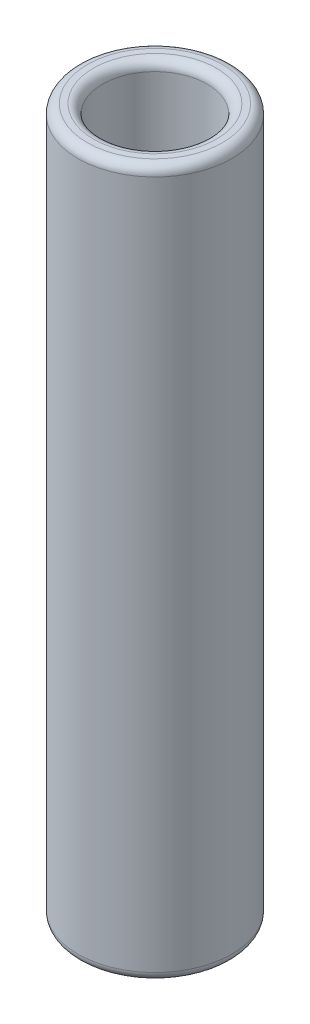
ISO-10303-21;
HEADER;
FILE_DESCRIPTION(('STEP AP214'),'2;1');
FILE_NAME('part.step','',(''),(''),'','','');
FILE_SCHEMA(('AUTOMOTIVE_DESIGN { 1 0 10303 214 1 1 1 1 }'));
ENDSEC;
DATA;
#1=APPLICATION_CONTEXT('core data for automotive mechanical design processes');
#2=APPLICATION_PROTOCOL_DEFINITION('international standard','automotive_design',2000,#1);
#3=PRODUCT_CONTEXT('',#1,'mechanical');
#4=PRODUCT('Part','Part','',(#3));
#5=PRODUCT_RELATED_PRODUCT_CATEGORY('part','',(#4));
#6=PRODUCT_DEFINITION_FORMATION('','',#4);
#7=PRODUCT_DEFINITION_CONTEXT('part definition',#1,'design');
#8=PRODUCT_DEFINITION('design','',#6,#7);
#9=PRODUCT_DEFINITION_SHAPE('','',#8);
#10=(LENGTH_UNIT() NAMED_UNIT(*) SI_UNIT(.MILLI.,.METRE.));
#11=(NAMED_UNIT(*) PLANE_ANGLE_UNIT() SI_UNIT($,.RADIAN.));
#12=(NAMED_UNIT(*) SI_UNIT($,.STERADIAN.) SOLID_ANGLE_UNIT());
#13=UNCERTAINTY_MEASURE_WITH_UNIT(LENGTH_MEASURE(1.E-05),#10,'distance_accuracy_value','');
#14=(GEOMETRIC_REPRESENTATION_CONTEXT(3) GLOBAL_UNCERTAINTY_ASSIGNED_CONTEXT((#13)) GLOBAL_UNIT_ASSIGNED_CONTEXT((#10,
#11,#12)) REPRESENTATION_CONTEXT('',''));
#15=CARTESIAN_POINT('',(0.,0.,0.));
#16=DIRECTION('',(0.,0.,1.));
#17=DIRECTION('',(1.,0.,0.));
#18=AXIS2_PLACEMENT_3D('',#15,#16,#17);
#19=CARTESIAN_POINT('',(0.,23.,0.));
#20=DIRECTION('',(0.,1.,0.));
#21=DIRECTION('',(0.,0.,1.));
#22=AXIS2_PLACEMENT_3D('',#19,#20,#21);
#23=PLANE('',#22);
#24=CARTESIAN_POINT('',(0.,23.,0.));
#25=DIRECTION('',(0.,1.,0.));
#26=DIRECTION('',(0.,0.,1.));
#27=AXIS2_PLACEMENT_3D('',#24,#25,#26);
#28=CIRCLE('',#27,2.);
#29=CARTESIAN_POINT('',(0.,23.,2.));
#30=VERTEX_POINT('',#29);
#31=EDGE_CURVE('E10',#30,#30,#28,.F.);
#32=ORIENTED_EDGE('',*,*,#31,.T.);
#33=EDGE_LOOP('',(#32));
#34=FACE_BOUND('',#33,.T.);
#35=CARTESIAN_POINT('',(0.,23.,0.));
#36=DIRECTION('',(0.,1.,0.));
#37=DIRECTION('',(0.,0.,1.));
#38=AXIS2_PLACEMENT_3D('',#35,#36,#37);
#39=CIRCLE('',#38,2.2);
#40=CARTESIAN_POINT('',(0.,23.,2.2));
#41=VERTEX_POINT('',#40);
#42=EDGE_CURVE('E42',#41,#41,#39,.T.);
#43=ORIENTED_EDGE('',*,*,#42,.T.);
#44=EDGE_LOOP('',(#43));
#45=FACE_BOUND('',#44,.T.);
#46=ADVANCED_FACE('F35',(#34,#45),#23,.T.);
#47=CARTESIAN_POINT('',(0.,0.,0.));
#48=DIRECTION('',(0.,1.,0.));
#49=DIRECTION('',(0.,0.,1.));
#50=AXIS2_PLACEMENT_3D('',#47,#48,#49);
#51=PLANE('',#50);
#52=CARTESIAN_POINT('',(0.,0.,0.));
#53=DIRECTION('',(0.,1.,0.));
#54=DIRECTION('',(0.,0.,1.));
#55=AXIS2_PLACEMENT_3D('',#52,#53,#54);
#56=CIRCLE('',#55,2.);
#57=CARTESIAN_POINT('',(0.,0.,2.));
#58=VERTEX_POINT('',#57);
#59=EDGE_CURVE('E61',#58,#58,#56,.T.);
#60=ORIENTED_EDGE('',*,*,#59,.T.);
#61=EDGE_LOOP('',(#60));
#62=FACE_BOUND('',#61,.T.);
#63=CARTESIAN_POINT('',(0.,0.,0.));
#64=DIRECTION('',(0.,1.,0.));
#65=DIRECTION('',(0.,0.,1.));
#66=AXIS2_PLACEMENT_3D('',#63,#64,#65);
#67=CIRCLE('',#66,2.2);
#68=CARTESIAN_POINT('',(0.,0.,2.2));
#69=VERTEX_POINT('',#68);
#70=EDGE_CURVE('E64',#69,#69,#67,.F.);
#71=ORIENTED_EDGE('',*,*,#70,.T.);
#72=EDGE_LOOP('',(#71));
#73=FACE_BOUND('',#72,.T.);
#74=ADVANCED_FACE('F68',(#62,#73),#51,.F.);
#75=CARTESIAN_POINT('',(0.,23.,0.));
#76=DIRECTION('',(0.,-1.,0.));
#77=DIRECTION('',(0.,0.,-1.));
#78=AXIS2_PLACEMENT_3D('',#75,#76,#77);
#79=CYLINDRICAL_SURFACE('',#78,2.5);
#80=CARTESIAN_POINT('',(0.,0.300000000000002,0.));
#81=DIRECTION('',(0.,1.,0.));
#82=DIRECTION('',(0.,0.,1.));
#83=AXIS2_PLACEMENT_3D('',#80,#81,#82);
#84=CIRCLE('',#83,2.5);
#85=CARTESIAN_POINT('',(0.,0.300000000000002,2.5));
#86=VERTEX_POINT('',#85);
#87=EDGE_CURVE('E46',#86,#86,#84,.T.);
#88=ORIENTED_EDGE('',*,*,#87,.T.);
#89=EDGE_LOOP('',(#88));
#90=FACE_BOUND('',#89,.T.);
#91=CARTESIAN_POINT('',(0.,22.7,0.));
#92=DIRECTION('',(0.,1.,0.));
#93=DIRECTION('',(0.,0.,1.));
#94=AXIS2_PLACEMENT_3D('',#91,#92,#93);
#95=CIRCLE('',#94,2.5);
#96=CARTESIAN_POINT('',(0.,22.7,2.5));
#97=VERTEX_POINT('',#96);
#98=EDGE_CURVE('E50',#97,#97,#95,.F.);
#99=ORIENTED_EDGE('',*,*,#98,.T.);
#100=EDGE_LOOP('',(#99));
#101=FACE_BOUND('',#100,.T.);
#102=ADVANCED_FACE('F78',(#90,#101),#79,.T.);
#103=CARTESIAN_POINT('',(0.,23.,0.));
#104=DIRECTION('',(0.,-1.,0.));
#105=DIRECTION('',(0.,0.,-1.));
#106=AXIS2_PLACEMENT_3D('',#103,#104,#105);
#107=CYLINDRICAL_SURFACE('',#106,1.7);
#108=CARTESIAN_POINT('',(0.,0.300000000000002,0.));
#109=DIRECTION('',(0.,1.,0.));
#110=DIRECTION('',(0.,0.,1.));
#111=AXIS2_PLACEMENT_3D('',#108,#109,#110);
#112=CIRCLE('',#111,1.7);
#113=CARTESIAN_POINT('',(0.,0.300000000000002,1.7));
#114=VERTEX_POINT('',#113);
#115=EDGE_CURVE('E55',#114,#114,#112,.F.);
#116=ORIENTED_EDGE('',*,*,#115,.T.);
#117=EDGE_LOOP('',(#116));
#118=FACE_BOUND('',#117,.T.);
#119=CARTESIAN_POINT('',(0.,22.7,0.));
#120=DIRECTION('',(0.,1.,0.));
#121=DIRECTION('',(0.,0.,1.));
#122=AXIS2_PLACEMENT_3D('',#119,#120,#121);
#123=CIRCLE('',#122,1.7);
#124=CARTESIAN_POINT('',(0.,22.7,1.7));
#125=VERTEX_POINT('',#124);
#126=EDGE_CURVE('E58',#125,#125,#123,.T.);
#127=ORIENTED_EDGE('',*,*,#126,.T.);
#128=EDGE_LOOP('',(#127));
#129=FACE_BOUND('',#128,.T.);
#130=ADVANCED_FACE('F81',(#118,#129),#107,.F.);
#131=CARTESIAN_POINT('',(0.,0.300000000000002,0.));
#132=DIRECTION('',(0.,1.,0.));
#133=DIRECTION('',(0.,0.,1.));
#134=AXIS2_PLACEMENT_3D('',#131,#132,#133);
#135=TOROIDAL_SURFACE('',#134,2.,0.3);
#136=ORIENTED_EDGE('',*,*,#115,.F.);
#137=EDGE_LOOP('',(#136));
#138=FACE_BOUND('',#137,.T.);
#139=ORIENTED_EDGE('',*,*,#59,.F.);
#140=EDGE_LOOP('',(#139));
#141=FACE_BOUND('',#140,.T.);
#142=ADVANCED_FACE('F74',(#138,#141),#135,.T.);
#143=CARTESIAN_POINT('',(0.,0.300000000000002,0.));
#144=DIRECTION('',(0.,1.,0.));
#145=DIRECTION('',(0.,0.,1.));
#146=AXIS2_PLACEMENT_3D('',#143,#144,#145);
#147=TOROIDAL_SURFACE('',#146,2.2,0.3);
#148=ORIENTED_EDGE('',*,*,#70,.F.);
#149=EDGE_LOOP('',(#148));
#150=FACE_BOUND('',#149,.T.);
#151=ORIENTED_EDGE('',*,*,#87,.F.);
#152=EDGE_LOOP('',(#151));
#153=FACE_BOUND('',#152,.T.);
#154=ADVANCED_FACE('F70',(#150,#153),#147,.T.);
#155=CARTESIAN_POINT('',(0.,22.7,0.));
#156=DIRECTION('',(0.,1.,0.));
#157=DIRECTION('',(0.,0.,1.));
#158=AXIS2_PLACEMENT_3D('',#155,#156,#157);
#159=TOROIDAL_SURFACE('',#158,2.,0.3);
#160=ORIENTED_EDGE('',*,*,#31,.F.);
#161=EDGE_LOOP('',(#160));
#162=FACE_BOUND('',#161,.T.);
#163=ORIENTED_EDGE('',*,*,#126,.F.);
#164=EDGE_LOOP('',(#163));
#165=FACE_BOUND('',#164,.T.);
#166=ADVANCED_FACE('F73',(#162,#165),#159,.T.);
#167=CARTESIAN_POINT('',(0.,22.7,0.));
#168=DIRECTION('',(0.,1.,0.));
#169=DIRECTION('',(0.,0.,1.));
#170=AXIS2_PLACEMENT_3D('',#167,#168,#169);
#171=TOROIDAL_SURFACE('',#170,2.2,0.3);
#172=ORIENTED_EDGE('',*,*,#98,.F.);
#173=EDGE_LOOP('',(#172));
#174=FACE_BOUND('',#173,.T.);
#175=ORIENTED_EDGE('',*,*,#42,.F.);
#176=EDGE_LOOP('',(#175));
#177=FACE_BOUND('',#176,.T.);
#178=ADVANCED_FACE('F37',(#174,#177),#171,.T.);
#179=CLOSED_SHELL('',(#46,#74,#102,#130,#142,#154,#166,#178));
#180=MANIFOLD_SOLID_BREP('B2',#179);
#181=ADVANCED_BREP_SHAPE_REPRESENTATION('',(#18,#180),#14);
#182=SHAPE_DEFINITION_REPRESENTATION(#9,#181);
ENDSEC;
END-ISO-10303-21;
